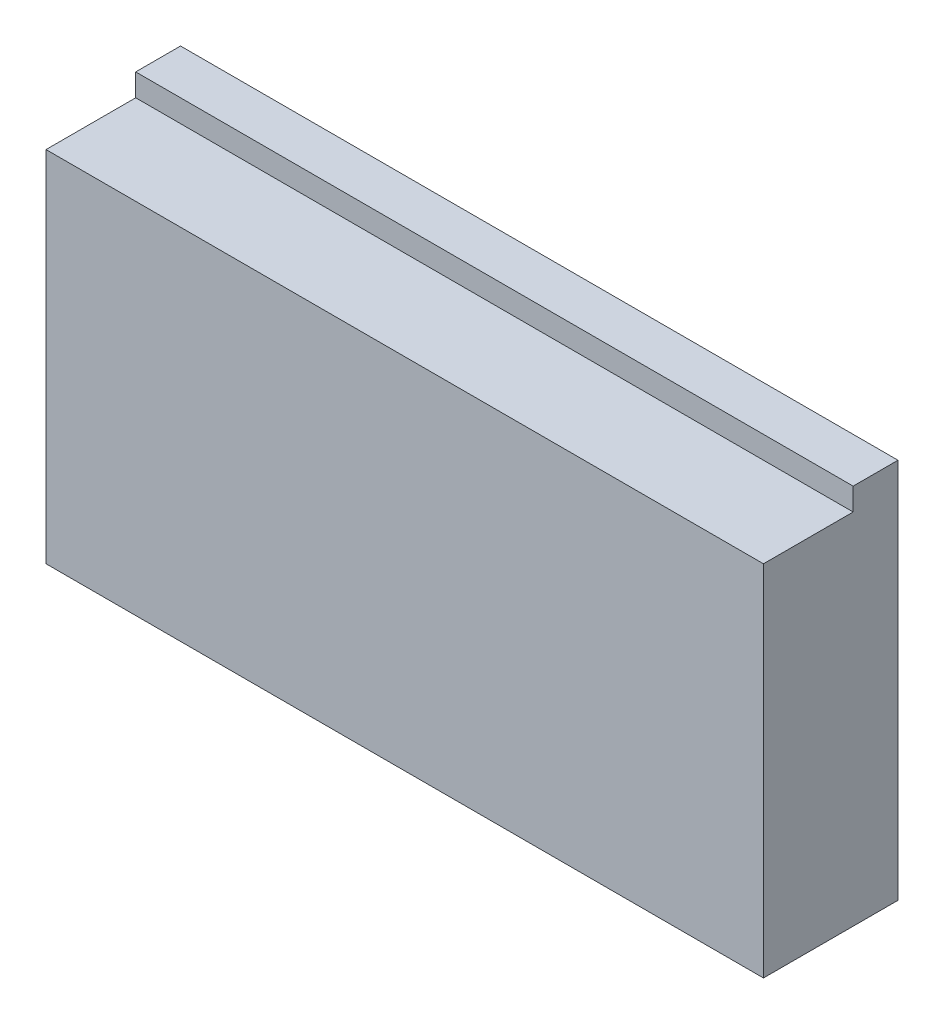
ISO-10303-21;
HEADER;
FILE_DESCRIPTION(('STEP AP214'),'2;1');
FILE_NAME('part.step','',(''),(''),'','','');
FILE_SCHEMA(('AUTOMOTIVE_DESIGN { 1 0 10303 214 1 1 1 1 }'));
ENDSEC;
DATA;
#1=APPLICATION_CONTEXT('core data for automotive mechanical design processes');
#2=APPLICATION_PROTOCOL_DEFINITION('international standard','automotive_design',2000,#1);
#3=PRODUCT_CONTEXT('',#1,'mechanical');
#4=PRODUCT('Part','Part','',(#3));
#5=PRODUCT_RELATED_PRODUCT_CATEGORY('part','',(#4));
#6=PRODUCT_DEFINITION_FORMATION('','',#4);
#7=PRODUCT_DEFINITION_CONTEXT('part definition',#1,'design');
#8=PRODUCT_DEFINITION('design','',#6,#7);
#9=PRODUCT_DEFINITION_SHAPE('','',#8);
#10=(LENGTH_UNIT() NAMED_UNIT(*) SI_UNIT(.MILLI.,.METRE.));
#11=(NAMED_UNIT(*) PLANE_ANGLE_UNIT() SI_UNIT($,.RADIAN.));
#12=(NAMED_UNIT(*) SI_UNIT($,.STERADIAN.) SOLID_ANGLE_UNIT());
#13=UNCERTAINTY_MEASURE_WITH_UNIT(LENGTH_MEASURE(1.E-05),#10,'distance_accuracy_value','');
#14=(GEOMETRIC_REPRESENTATION_CONTEXT(3) GLOBAL_UNCERTAINTY_ASSIGNED_CONTEXT((#13)) GLOBAL_UNIT_ASSIGNED_CONTEXT((#10,
#11,#12)) REPRESENTATION_CONTEXT('',''));
#15=CARTESIAN_POINT('',(0.,0.,0.));
#16=DIRECTION('',(0.,0.,1.));
#17=DIRECTION('',(1.,0.,0.));
#18=AXIS2_PLACEMENT_3D('',#15,#16,#17);
#19=CARTESIAN_POINT('',(0.,16.,0.));
#20=DIRECTION('',(0.,-1.,0.));
#21=DIRECTION('',(0.,0.,-1.));
#22=AXIS2_PLACEMENT_3D('',#19,#20,#21);
#23=PLANE('',#22);
#24=DIRECTION('',(1.,0.,0.));
#25=VECTOR('',#24,1.);
#26=CARTESIAN_POINT('',(0.,16.,-4.));
#27=LINE('',#26,#25);
#28=CARTESIAN_POINT('',(0.,16.,-4.));
#29=VERTEX_POINT('',#28);
#30=CARTESIAN_POINT('',(32.,16.,-4.));
#31=VERTEX_POINT('',#30);
#32=EDGE_CURVE('E52',#29,#31,#27,.T.);
#33=ORIENTED_EDGE('',*,*,#32,.F.);
#34=DIRECTION('',(0.,0.,1.));
#35=VECTOR('',#34,1.);
#36=CARTESIAN_POINT('',(0.,16.,0.));
#37=LINE('',#36,#35);
#38=CARTESIAN_POINT('',(0.,16.,0.));
#39=VERTEX_POINT('',#38);
#40=EDGE_CURVE('E89',#29,#39,#37,.T.);
#41=ORIENTED_EDGE('',*,*,#40,.T.);
#42=DIRECTION('',(1.,0.,0.));
#43=VECTOR('',#42,1.);
#44=CARTESIAN_POINT('',(0.,16.,0.));
#45=LINE('',#44,#43);
#46=CARTESIAN_POINT('',(32.,16.,0.));
#47=VERTEX_POINT('',#46);
#48=EDGE_CURVE('E58',#39,#47,#45,.T.);
#49=ORIENTED_EDGE('',*,*,#48,.T.);
#50=DIRECTION('',(0.,0.,-1.));
#51=VECTOR('',#50,1.);
#52=CARTESIAN_POINT('',(32.,16.,0.));
#53=LINE('',#52,#51);
#54=EDGE_CURVE('E100',#47,#31,#53,.T.);
#55=ORIENTED_EDGE('',*,*,#54,.T.);
#56=EDGE_LOOP('',(#33,#41,#49,#55));
#57=FACE_BOUND('',#56,.T.);
#58=ADVANCED_FACE('F37',(#57),#23,.F.);
#59=CARTESIAN_POINT('',(0.,16.,0.));
#60=DIRECTION('',(1.,0.,0.));
#61=DIRECTION('',(0.,0.,-1.));
#62=AXIS2_PLACEMENT_3D('',#59,#60,#61);
#63=PLANE('',#62);
#64=DIRECTION('',(0.,0.,1.));
#65=VECTOR('',#64,1.);
#66=CARTESIAN_POINT('',(0.,0.,0.));
#67=LINE('',#66,#65);
#68=CARTESIAN_POINT('',(0.,0.,-6.));
#69=VERTEX_POINT('',#68);
#70=CARTESIAN_POINT('',(0.,0.,0.));
#71=VERTEX_POINT('',#70);
#72=EDGE_CURVE('E96',#69,#71,#67,.T.);
#73=ORIENTED_EDGE('',*,*,#72,.T.);
#74=DIRECTION('',(0.,-1.,0.));
#75=VECTOR('',#74,1.);
#76=CARTESIAN_POINT('',(0.,16.,0.));
#77=LINE('',#76,#75);
#78=EDGE_CURVE('E11',#39,#71,#77,.T.);
#79=ORIENTED_EDGE('',*,*,#78,.F.);
#80=ORIENTED_EDGE('',*,*,#40,.F.);
#81=DIRECTION('',(0.,-1.,0.));
#82=VECTOR('',#81,1.);
#83=CARTESIAN_POINT('',(0.,17.,-4.));
#84=LINE('',#83,#82);
#85=CARTESIAN_POINT('',(0.,17.,-4.));
#86=VERTEX_POINT('',#85);
#87=EDGE_CURVE('E104',#86,#29,#84,.T.);
#88=ORIENTED_EDGE('',*,*,#87,.F.);
#89=DIRECTION('',(0.,0.,1.));
#90=VECTOR('',#89,1.);
#91=CARTESIAN_POINT('',(0.,17.,-6.));
#92=LINE('',#91,#90);
#93=CARTESIAN_POINT('',(0.,17.,-6.));
#94=VERTEX_POINT('',#93);
#95=EDGE_CURVE('E99',#94,#86,#92,.T.);
#96=ORIENTED_EDGE('',*,*,#95,.F.);
#97=DIRECTION('',(0.,-1.,0.));
#98=VECTOR('',#97,1.);
#99=CARTESIAN_POINT('',(0.,16.,-6.));
#100=LINE('',#99,#98);
#101=EDGE_CURVE('E82',#94,#69,#100,.T.);
#102=ORIENTED_EDGE('',*,*,#101,.T.);
#103=EDGE_LOOP('',(#73,#79,#80,#88,#96,#102));
#104=FACE_BOUND('',#103,.T.);
#105=ADVANCED_FACE('F39',(#104),#63,.F.);
#106=CARTESIAN_POINT('',(0.,16.,0.));
#107=DIRECTION('',(0.,0.,-1.));
#108=DIRECTION('',(-1.,0.,0.));
#109=AXIS2_PLACEMENT_3D('',#106,#107,#108);
#110=PLANE('',#109);
#111=DIRECTION('',(1.,0.,0.));
#112=VECTOR('',#111,1.);
#113=CARTESIAN_POINT('',(0.,0.,0.));
#114=LINE('',#113,#112);
#115=CARTESIAN_POINT('',(32.,0.,0.));
#116=VERTEX_POINT('',#115);
#117=EDGE_CURVE('E103',#71,#116,#114,.T.);
#118=ORIENTED_EDGE('',*,*,#117,.T.);
#119=DIRECTION('',(0.,-1.,0.));
#120=VECTOR('',#119,1.);
#121=CARTESIAN_POINT('',(32.,16.,0.));
#122=LINE('',#121,#120);
#123=EDGE_CURVE('E45',#47,#116,#122,.T.);
#124=ORIENTED_EDGE('',*,*,#123,.F.);
#125=ORIENTED_EDGE('',*,*,#48,.F.);
#126=ORIENTED_EDGE('',*,*,#78,.T.);
#127=EDGE_LOOP('',(#118,#124,#125,#126));
#128=FACE_BOUND('',#127,.T.);
#129=ADVANCED_FACE('F120',(#128),#110,.F.);
#130=CARTESIAN_POINT('',(32.,16.,0.));
#131=DIRECTION('',(-1.,0.,0.));
#132=DIRECTION('',(0.,0.,1.));
#133=AXIS2_PLACEMENT_3D('',#130,#131,#132);
#134=PLANE('',#133);
#135=DIRECTION('',(0.,0.,-1.));
#136=VECTOR('',#135,1.);
#137=CARTESIAN_POINT('',(32.,0.,0.));
#138=LINE('',#137,#136);
#139=CARTESIAN_POINT('',(32.,0.,-6.));
#140=VERTEX_POINT('',#139);
#141=EDGE_CURVE('E90',#116,#140,#138,.T.);
#142=ORIENTED_EDGE('',*,*,#141,.T.);
#143=DIRECTION('',(0.,-1.,0.));
#144=VECTOR('',#143,1.);
#145=CARTESIAN_POINT('',(32.,16.,-6.));
#146=LINE('',#145,#144);
#147=CARTESIAN_POINT('',(32.,17.,-6.));
#148=VERTEX_POINT('',#147);
#149=EDGE_CURVE('E85',#148,#140,#146,.T.);
#150=ORIENTED_EDGE('',*,*,#149,.F.);
#151=DIRECTION('',(0.,0.,-1.));
#152=VECTOR('',#151,1.);
#153=CARTESIAN_POINT('',(32.,17.,-6.));
#154=LINE('',#153,#152);
#155=CARTESIAN_POINT('',(32.,17.,-4.));
#156=VERTEX_POINT('',#155);
#157=EDGE_CURVE('E135',#156,#148,#154,.T.);
#158=ORIENTED_EDGE('',*,*,#157,.F.);
#159=DIRECTION('',(0.,-1.,0.));
#160=VECTOR('',#159,1.);
#161=CARTESIAN_POINT('',(32.,17.,-4.));
#162=LINE('',#161,#160);
#163=EDGE_CURVE('E108',#156,#31,#162,.T.);
#164=ORIENTED_EDGE('',*,*,#163,.T.);
#165=ORIENTED_EDGE('',*,*,#54,.F.);
#166=ORIENTED_EDGE('',*,*,#123,.T.);
#167=EDGE_LOOP('',(#142,#150,#158,#164,#165,#166));
#168=FACE_BOUND('',#167,.T.);
#169=ADVANCED_FACE('F117',(#168),#134,.F.);
#170=CARTESIAN_POINT('',(0.,16.,-6.));
#171=DIRECTION('',(0.,0.,1.));
#172=DIRECTION('',(1.,0.,0.));
#173=AXIS2_PLACEMENT_3D('',#170,#171,#172);
#174=PLANE('',#173);
#175=DIRECTION('',(-1.,0.,0.));
#176=VECTOR('',#175,1.);
#177=CARTESIAN_POINT('',(0.,0.,-6.));
#178=LINE('',#177,#176);
#179=EDGE_CURVE('E78',#140,#69,#178,.T.);
#180=ORIENTED_EDGE('',*,*,#179,.T.);
#181=ORIENTED_EDGE('',*,*,#101,.F.);
#182=DIRECTION('',(-1.,0.,0.));
#183=VECTOR('',#182,1.);
#184=CARTESIAN_POINT('',(0.,17.,-6.));
#185=LINE('',#184,#183);
#186=EDGE_CURVE('E138',#148,#94,#185,.T.);
#187=ORIENTED_EDGE('',*,*,#186,.F.);
#188=ORIENTED_EDGE('',*,*,#149,.T.);
#189=EDGE_LOOP('',(#180,#181,#187,#188));
#190=FACE_BOUND('',#189,.T.);
#191=ADVANCED_FACE('F80',(#190),#174,.F.);
#192=CARTESIAN_POINT('',(0.,0.,0.));
#193=DIRECTION('',(0.,-1.,0.));
#194=DIRECTION('',(0.,0.,-1.));
#195=AXIS2_PLACEMENT_3D('',#192,#193,#194);
#196=PLANE('',#195);
#197=ORIENTED_EDGE('',*,*,#72,.F.);
#198=ORIENTED_EDGE('',*,*,#179,.F.);
#199=ORIENTED_EDGE('',*,*,#141,.F.);
#200=ORIENTED_EDGE('',*,*,#117,.F.);
#201=EDGE_LOOP('',(#197,#198,#199,#200));
#202=FACE_BOUND('',#201,.T.);
#203=ADVANCED_FACE('F102',(#202),#196,.T.);
#204=CARTESIAN_POINT('',(0.,17.,-4.));
#205=DIRECTION('',(0.,0.,-1.));
#206=DIRECTION('',(-1.,0.,0.));
#207=AXIS2_PLACEMENT_3D('',#204,#205,#206);
#208=PLANE('',#207);
#209=ORIENTED_EDGE('',*,*,#32,.T.);
#210=ORIENTED_EDGE('',*,*,#163,.F.);
#211=DIRECTION('',(1.,0.,0.));
#212=VECTOR('',#211,1.);
#213=CARTESIAN_POINT('',(0.,17.,-4.));
#214=LINE('',#213,#212);
#215=EDGE_CURVE('E129',#86,#156,#214,.T.);
#216=ORIENTED_EDGE('',*,*,#215,.F.);
#217=ORIENTED_EDGE('',*,*,#87,.T.);
#218=EDGE_LOOP('',(#209,#210,#216,#217));
#219=FACE_BOUND('',#218,.T.);
#220=ADVANCED_FACE('F125',(#219),#208,.F.);
#221=CARTESIAN_POINT('',(0.,17.,0.));
#222=DIRECTION('',(0.,1.,0.));
#223=DIRECTION('',(0.,0.,1.));
#224=AXIS2_PLACEMENT_3D('',#221,#222,#223);
#225=PLANE('',#224);
#226=ORIENTED_EDGE('',*,*,#95,.T.);
#227=ORIENTED_EDGE('',*,*,#215,.T.);
#228=ORIENTED_EDGE('',*,*,#157,.T.);
#229=ORIENTED_EDGE('',*,*,#186,.T.);
#230=EDGE_LOOP('',(#226,#227,#228,#229));
#231=FACE_BOUND('',#230,.T.);
#232=ADVANCED_FACE('F137',(#231),#225,.T.);
#233=CLOSED_SHELL('',(#58,#105,#129,#169,#191,#203,#220,#232));
#234=MANIFOLD_SOLID_BREP('B2',#233);
#235=ADVANCED_BREP_SHAPE_REPRESENTATION('',(#18,#234),#14);
#236=SHAPE_DEFINITION_REPRESENTATION(#9,#235);
ENDSEC;
END-ISO-10303-21;
